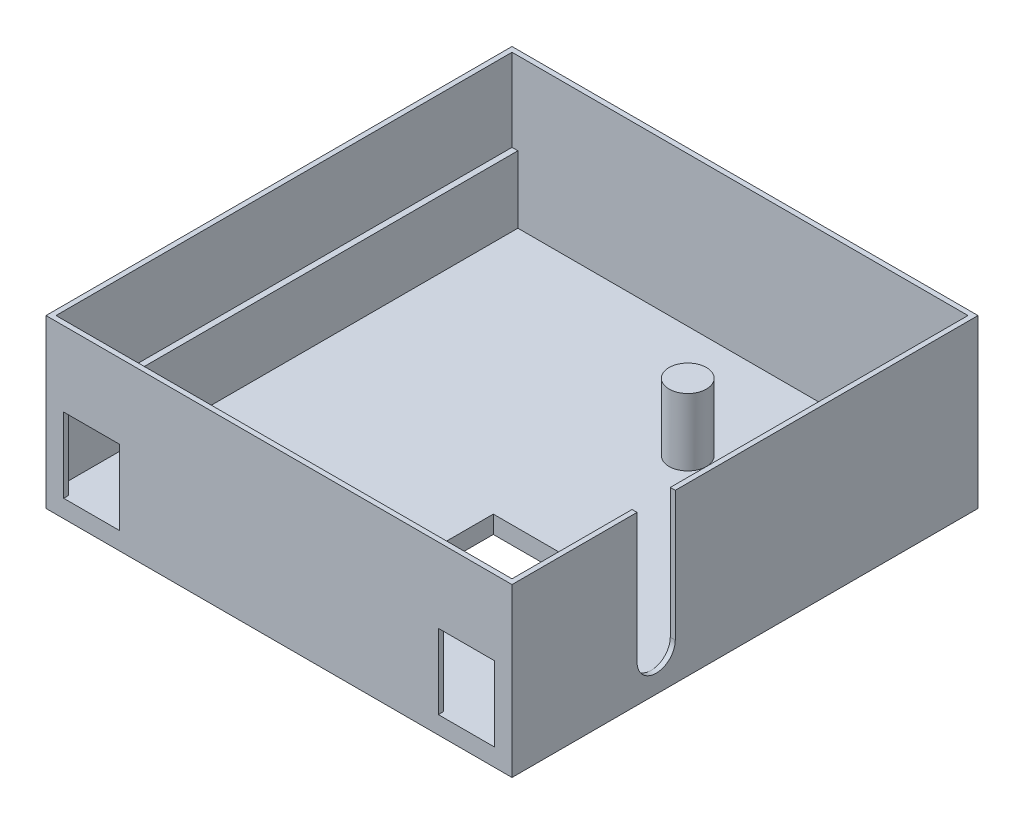
ISO-10303-21;
HEADER;
FILE_DESCRIPTION(('STEP AP214'),'2;1');
FILE_NAME('part.step','',(''),(''),'','','');
FILE_SCHEMA(('AUTOMOTIVE_DESIGN { 1 0 10303 214 1 1 1 1 }'));
ENDSEC;
DATA;
#1=APPLICATION_CONTEXT('core data for automotive mechanical design processes');
#2=APPLICATION_PROTOCOL_DEFINITION('international standard','automotive_design',2000,#1);
#3=PRODUCT_CONTEXT('',#1,'mechanical');
#4=PRODUCT('Part','Part','',(#3));
#5=PRODUCT_RELATED_PRODUCT_CATEGORY('part','',(#4));
#6=PRODUCT_DEFINITION_FORMATION('','',#4);
#7=PRODUCT_DEFINITION_CONTEXT('part definition',#1,'design');
#8=PRODUCT_DEFINITION('design','',#6,#7);
#9=PRODUCT_DEFINITION_SHAPE('','',#8);
#10=(LENGTH_UNIT() NAMED_UNIT(*) SI_UNIT(.MILLI.,.METRE.));
#11=(NAMED_UNIT(*) PLANE_ANGLE_UNIT() SI_UNIT($,.RADIAN.));
#12=(NAMED_UNIT(*) SI_UNIT($,.STERADIAN.) SOLID_ANGLE_UNIT());
#13=UNCERTAINTY_MEASURE_WITH_UNIT(LENGTH_MEASURE(1.E-05),#10,'distance_accuracy_value','');
#14=(GEOMETRIC_REPRESENTATION_CONTEXT(3) GLOBAL_UNCERTAINTY_ASSIGNED_CONTEXT((#13)) GLOBAL_UNIT_ASSIGNED_CONTEXT((#10,
#11,#12)) REPRESENTATION_CONTEXT('',''));
#15=CARTESIAN_POINT('',(0.,0.,0.));
#16=DIRECTION('',(0.,0.,1.));
#17=DIRECTION('',(1.,0.,0.));
#18=AXIS2_PLACEMENT_3D('',#15,#16,#17);
#19=CARTESIAN_POINT('',(-38.75,28.4,-38.75));
#20=DIRECTION('',(0.,0.,1.));
#21=DIRECTION('',(1.,0.,0.));
#22=AXIS2_PLACEMENT_3D('',#19,#20,#21);
#23=PLANE('',#22);
#24=DIRECTION('',(-1.,0.,0.));
#25=VECTOR('',#24,1.);
#26=CARTESIAN_POINT('',(-38.75,14.4,-38.75));
#27=LINE('',#26,#25);
#28=CARTESIAN_POINT('',(-37.75,14.4,-38.75));
#29=VERTEX_POINT('',#28);
#30=CARTESIAN_POINT('',(-38.75,14.4,-38.75));
#31=VERTEX_POINT('',#30);
#32=EDGE_CURVE('E266',#29,#31,#27,.T.);
#33=ORIENTED_EDGE('',*,*,#32,.F.);
#34=DIRECTION('',(0.,-1.,0.));
#35=VECTOR('',#34,1.);
#36=CARTESIAN_POINT('',(-37.75,14.4,-38.75));
#37=LINE('',#36,#35);
#38=CARTESIAN_POINT('',(-37.75,3.,-38.75));
#39=VERTEX_POINT('',#38);
#40=EDGE_CURVE('E270',#29,#39,#37,.T.);
#41=ORIENTED_EDGE('',*,*,#40,.T.);
#42=DIRECTION('',(-1.,0.,0.));
#43=VECTOR('',#42,1.);
#44=CARTESIAN_POINT('',(-38.75,3.,-38.75));
#45=LINE('',#44,#43);
#46=CARTESIAN_POINT('',(38.75,3.,-38.75));
#47=VERTEX_POINT('',#46);
#48=EDGE_CURVE('E418',#47,#39,#45,.T.);
#49=ORIENTED_EDGE('',*,*,#48,.F.);
#50=DIRECTION('',(0.,-1.,0.));
#51=VECTOR('',#50,1.);
#52=CARTESIAN_POINT('',(38.75,28.4,-38.75));
#53=LINE('',#52,#51);
#54=CARTESIAN_POINT('',(38.75,28.4,-38.75));
#55=VERTEX_POINT('',#54);
#56=EDGE_CURVE('E441',#55,#47,#53,.T.);
#57=ORIENTED_EDGE('',*,*,#56,.F.);
#58=DIRECTION('',(-1.,0.,0.));
#59=VECTOR('',#58,1.);
#60=CARTESIAN_POINT('',(-38.75,28.4,-38.75));
#61=LINE('',#60,#59);
#62=CARTESIAN_POINT('',(-38.75,28.4,-38.75));
#63=VERTEX_POINT('',#62);
#64=EDGE_CURVE('E403',#55,#63,#61,.T.);
#65=ORIENTED_EDGE('',*,*,#64,.T.);
#66=DIRECTION('',(0.,-1.,0.));
#67=VECTOR('',#66,1.);
#68=CARTESIAN_POINT('',(-38.75,28.4,-38.75));
#69=LINE('',#68,#67);
#70=EDGE_CURVE('E437',#63,#31,#69,.T.);
#71=ORIENTED_EDGE('',*,*,#70,.T.);
#72=EDGE_LOOP('',(#33,#41,#49,#57,#65,#71));
#73=FACE_BOUND('',#72,.T.);
#74=ADVANCED_FACE('F39',(#73),#23,.T.);
#75=CARTESIAN_POINT('',(-38.75,28.4,38.75));
#76=DIRECTION('',(1.,0.,0.));
#77=DIRECTION('',(0.,0.,-1.));
#78=AXIS2_PLACEMENT_3D('',#75,#76,#77);
#79=PLANE('',#78);
#80=DIRECTION('',(0.,0.,1.));
#81=VECTOR('',#80,1.);
#82=CARTESIAN_POINT('',(-38.75,3.,38.75));
#83=LINE('',#82,#81);
#84=CARTESIAN_POINT('',(-38.75,3.,26.25));
#85=VERTEX_POINT('',#84);
#86=CARTESIAN_POINT('',(-38.75,3.,38.75));
#87=VERTEX_POINT('',#86);
#88=EDGE_CURVE('E421',#85,#87,#83,.T.);
#89=ORIENTED_EDGE('',*,*,#88,.F.);
#90=DIRECTION('',(0.,-1.,0.));
#91=VECTOR('',#90,1.);
#92=CARTESIAN_POINT('',(-38.75,14.4,26.25));
#93=LINE('',#92,#91);
#94=CARTESIAN_POINT('',(-38.75,14.4,26.25));
#95=VERTEX_POINT('',#94);
#96=EDGE_CURVE('E284',#95,#85,#93,.T.);
#97=ORIENTED_EDGE('',*,*,#96,.F.);
#98=DIRECTION('',(0.,0.,1.));
#99=VECTOR('',#98,1.);
#100=CARTESIAN_POINT('',(-38.75,14.4,-38.75));
#101=LINE('',#100,#99);
#102=EDGE_CURVE('E254',#31,#95,#101,.T.);
#103=ORIENTED_EDGE('',*,*,#102,.F.);
#104=ORIENTED_EDGE('',*,*,#70,.F.);
#105=DIRECTION('',(0.,0.,1.));
#106=VECTOR('',#105,1.);
#107=CARTESIAN_POINT('',(-38.75,28.4,38.75));
#108=LINE('',#107,#106);
#109=CARTESIAN_POINT('',(-38.75,28.4,38.75));
#110=VERTEX_POINT('',#109);
#111=EDGE_CURVE('E407',#63,#110,#108,.T.);
#112=ORIENTED_EDGE('',*,*,#111,.T.);
#113=DIRECTION('',(0.,-1.,0.));
#114=VECTOR('',#113,1.);
#115=CARTESIAN_POINT('',(-38.75,28.4,38.75));
#116=LINE('',#115,#114);
#117=EDGE_CURVE('E433',#110,#87,#116,.T.);
#118=ORIENTED_EDGE('',*,*,#117,.T.);
#119=EDGE_LOOP('',(#89,#97,#103,#104,#112,#118));
#120=FACE_BOUND('',#119,.T.);
#121=ADVANCED_FACE('F529',(#120),#79,.T.);
#122=CARTESIAN_POINT('',(0.,3.,0.));
#123=DIRECTION('',(0.,-1.,0.));
#124=DIRECTION('',(0.,0.,-1.));
#125=AXIS2_PLACEMENT_3D('',#122,#123,#124);
#126=PLANE('',#125);
#127=DIRECTION('',(-1.,0.,0.));
#128=VECTOR('',#127,1.);
#129=CARTESIAN_POINT('',(2.2375,3.,5.4125));
#130=LINE('',#129,#128);
#131=CARTESIAN_POINT('',(14.9375,3.,5.4125));
#132=VERTEX_POINT('',#131);
#133=CARTESIAN_POINT('',(2.2375,3.,5.4125));
#134=VERTEX_POINT('',#133);
#135=EDGE_CURVE('E231',#132,#134,#130,.T.);
#136=ORIENTED_EDGE('',*,*,#135,.F.);
#137=DIRECTION('',(0.,0.,-1.));
#138=VECTOR('',#137,1.);
#139=CARTESIAN_POINT('',(14.9375,3.,18.1125));
#140=LINE('',#139,#138);
#141=CARTESIAN_POINT('',(14.9375,3.,18.1125));
#142=VERTEX_POINT('',#141);
#143=EDGE_CURVE('E55',#142,#132,#140,.T.);
#144=ORIENTED_EDGE('',*,*,#143,.F.);
#145=DIRECTION('',(1.,0.,0.));
#146=VECTOR('',#145,1.);
#147=CARTESIAN_POINT('',(2.2375,3.,18.1125));
#148=LINE('',#147,#146);
#149=CARTESIAN_POINT('',(2.2375,3.,18.1125));
#150=VERTEX_POINT('',#149);
#151=EDGE_CURVE('E239',#150,#142,#148,.T.);
#152=ORIENTED_EDGE('',*,*,#151,.F.);
#153=DIRECTION('',(0.,0.,1.));
#154=VECTOR('',#153,1.);
#155=CARTESIAN_POINT('',(2.2375,3.,18.1125));
#156=LINE('',#155,#154);
#157=EDGE_CURVE('E221',#134,#150,#156,.T.);
#158=ORIENTED_EDGE('',*,*,#157,.F.);
#159=EDGE_LOOP('',(#136,#144,#152,#158));
#160=FACE_BOUND('',#159,.T.);
#161=CARTESIAN_POINT('',(10.175,3.,-19.7));
#162=DIRECTION('',(0.,-1.,0.));
#163=DIRECTION('',(0.,0.,-1.));
#164=AXIS2_PLACEMENT_3D('',#161,#162,#163);
#165=CIRCLE('',#164,3.175);
#166=CARTESIAN_POINT('',(10.175,3.,-22.875));
#167=VERTEX_POINT('',#166);
#168=EDGE_CURVE('E497',#167,#167,#165,.F.);
#169=ORIENTED_EDGE('',*,*,#168,.F.);
#170=EDGE_LOOP('',(#169));
#171=FACE_BOUND('',#170,.T.);
#172=DIRECTION('',(1.,0.,0.));
#173=VECTOR('',#172,1.);
#174=CARTESIAN_POINT('',(-38.75,3.,26.25));
#175=LINE('',#174,#173);
#176=CARTESIAN_POINT('',(-37.75,3.,26.25));
#177=VERTEX_POINT('',#176);
#178=EDGE_CURVE('E249',#85,#177,#175,.T.);
#179=ORIENTED_EDGE('',*,*,#178,.F.);
#180=ORIENTED_EDGE('',*,*,#88,.T.);
#181=DIRECTION('',(1.,0.,0.));
#182=VECTOR('',#181,1.);
#183=CARTESIAN_POINT('',(-38.75,3.,38.75));
#184=LINE('',#183,#182);
#185=CARTESIAN_POINT('',(-36.6,3.,38.75));
#186=VERTEX_POINT('',#185);
#187=EDGE_CURVE('E425',#87,#186,#184,.T.);
#188=ORIENTED_EDGE('',*,*,#187,.T.);
#189=DIRECTION('',(0.,0.,1.));
#190=VECTOR('',#189,1.);
#191=CARTESIAN_POINT('',(-36.6,3.,20.55));
#192=LINE('',#191,#190);
#193=CARTESIAN_POINT('',(-36.6,3.,39.6));
#194=VERTEX_POINT('',#193);
#195=EDGE_CURVE('E340',#186,#194,#192,.T.);
#196=ORIENTED_EDGE('',*,*,#195,.T.);
#197=DIRECTION('',(1.,0.,0.));
#198=VECTOR('',#197,1.);
#199=CARTESIAN_POINT('',(-36.6,3.,39.6));
#200=LINE('',#199,#198);
#201=CARTESIAN_POINT('',(-27.075,3.,39.6));
#202=VERTEX_POINT('',#201);
#203=EDGE_CURVE('E333',#194,#202,#200,.T.);
#204=ORIENTED_EDGE('',*,*,#203,.T.);
#205=DIRECTION('',(0.,0.,1.));
#206=VECTOR('',#205,1.);
#207=CARTESIAN_POINT('',(-27.075,3.,20.55));
#208=LINE('',#207,#206);
#209=CARTESIAN_POINT('',(-27.075,3.,38.75));
#210=VERTEX_POINT('',#209);
#211=EDGE_CURVE('E297',#210,#202,#208,.T.);
#212=ORIENTED_EDGE('',*,*,#211,.F.);
#213=CARTESIAN_POINT('',(27.075,3.,38.75));
#214=VERTEX_POINT('',#213);
#215=EDGE_CURVE('E429',#210,#214,#184,.T.);
#216=ORIENTED_EDGE('',*,*,#215,.T.);
#217=DIRECTION('',(0.,0.,1.));
#218=VECTOR('',#217,1.);
#219=CARTESIAN_POINT('',(27.075,3.,20.55));
#220=LINE('',#219,#218);
#221=CARTESIAN_POINT('',(27.075,3.,39.6));
#222=VERTEX_POINT('',#221);
#223=EDGE_CURVE('E314',#214,#222,#220,.T.);
#224=ORIENTED_EDGE('',*,*,#223,.T.);
#225=DIRECTION('',(1.,0.,0.));
#226=VECTOR('',#225,1.);
#227=CARTESIAN_POINT('',(27.075,3.,39.6));
#228=LINE('',#227,#226);
#229=CARTESIAN_POINT('',(36.6,3.,39.6));
#230=VERTEX_POINT('',#229);
#231=EDGE_CURVE('E305',#222,#230,#228,.T.);
#232=ORIENTED_EDGE('',*,*,#231,.T.);
#233=DIRECTION('',(0.,0.,1.));
#234=VECTOR('',#233,1.);
#235=CARTESIAN_POINT('',(36.6,3.,20.55));
#236=LINE('',#235,#234);
#237=CARTESIAN_POINT('',(36.6,3.,38.75));
#238=VERTEX_POINT('',#237);
#239=EDGE_CURVE('E310',#238,#230,#236,.T.);
#240=ORIENTED_EDGE('',*,*,#239,.F.);
#241=CARTESIAN_POINT('',(38.75,3.,38.75));
#242=VERTEX_POINT('',#241);
#243=EDGE_CURVE('E424',#238,#242,#184,.T.);
#244=ORIENTED_EDGE('',*,*,#243,.T.);
#245=DIRECTION('',(0.,0.,-1.));
#246=VECTOR('',#245,1.);
#247=CARTESIAN_POINT('',(38.75,3.,38.75));
#248=LINE('',#247,#246);
#249=EDGE_CURVE('E398',#242,#47,#248,.T.);
#250=ORIENTED_EDGE('',*,*,#249,.T.);
#251=ORIENTED_EDGE('',*,*,#48,.T.);
#252=DIRECTION('',(0.,0.,-1.));
#253=VECTOR('',#252,1.);
#254=CARTESIAN_POINT('',(-37.75,3.,-38.75));
#255=LINE('',#254,#253);
#256=EDGE_CURVE('E259',#177,#39,#255,.T.);
#257=ORIENTED_EDGE('',*,*,#256,.F.);
#258=EDGE_LOOP('',(#179,#180,#188,#196,#204,#212,#216,#224,#232,#240,#244,#250,#251,#257));
#259=FACE_BOUND('',#258,.T.);
#260=ADVANCED_FACE('F236',(#160,#171,#259),#126,.F.);
#261=CARTESIAN_POINT('',(39.6,3.,39.6));
#262=DIRECTION('',(-1.,0.,0.));
#263=DIRECTION('',(0.,0.,1.));
#264=AXIS2_PLACEMENT_3D('',#261,#262,#263);
#265=PLANE('',#264);
#266=DIRECTION('',(0.,0.,-1.));
#267=VECTOR('',#266,1.);
#268=CARTESIAN_POINT('',(39.6,28.4,39.6));
#269=LINE('',#268,#267);
#270=CARTESIAN_POINT('',(39.6,28.4,11.85));
#271=VERTEX_POINT('',#270);
#272=CARTESIAN_POINT('',(39.6,28.4,-39.6));
#273=VERTEX_POINT('',#272);
#274=EDGE_CURVE('E445',#271,#273,#269,.T.);
#275=ORIENTED_EDGE('',*,*,#274,.F.);
#276=DIRECTION('',(0.,1.,0.));
#277=VECTOR('',#276,1.);
#278=CARTESIAN_POINT('',(39.6,0.,11.85));
#279=LINE('',#278,#277);
#280=CARTESIAN_POINT('',(39.6,6.35,11.85));
#281=VERTEX_POINT('',#280);
#282=EDGE_CURVE('E368',#281,#271,#279,.T.);
#283=ORIENTED_EDGE('',*,*,#282,.F.);
#284=CARTESIAN_POINT('',(39.6,6.35,15.1));
#285=DIRECTION('',(1.,0.,0.));
#286=DIRECTION('',(0.,0.,-1.));
#287=AXIS2_PLACEMENT_3D('',#284,#285,#286);
#288=CIRCLE('',#287,3.25);
#289=CARTESIAN_POINT('',(39.6,6.35,18.35));
#290=VERTEX_POINT('',#289);
#291=EDGE_CURVE('E362',#290,#281,#288,.T.);
#292=ORIENTED_EDGE('',*,*,#291,.F.);
#293=DIRECTION('',(0.,-1.,0.));
#294=VECTOR('',#293,1.);
#295=CARTESIAN_POINT('',(39.6,0.,18.35));
#296=LINE('',#295,#294);
#297=CARTESIAN_POINT('',(39.6,28.4,18.35));
#298=VERTEX_POINT('',#297);
#299=EDGE_CURVE('E363',#298,#290,#296,.T.);
#300=ORIENTED_EDGE('',*,*,#299,.F.);
#301=CARTESIAN_POINT('',(39.6,28.4,39.6));
#302=VERTEX_POINT('',#301);
#303=EDGE_CURVE('E446',#302,#298,#269,.T.);
#304=ORIENTED_EDGE('',*,*,#303,.F.);
#305=DIRECTION('',(0.,-1.,0.));
#306=VECTOR('',#305,1.);
#307=CARTESIAN_POINT('',(39.6,3.,39.6));
#308=LINE('',#307,#306);
#309=CARTESIAN_POINT('',(39.6,0.,39.6));
#310=VERTEX_POINT('',#309);
#311=EDGE_CURVE('E475',#302,#310,#308,.T.);
#312=ORIENTED_EDGE('',*,*,#311,.T.);
#313=DIRECTION('',(0.,0.,-1.));
#314=VECTOR('',#313,1.);
#315=CARTESIAN_POINT('',(39.6,0.,39.6));
#316=LINE('',#315,#314);
#317=CARTESIAN_POINT('',(39.6,0.,-39.6));
#318=VERTEX_POINT('',#317);
#319=EDGE_CURVE('E462',#310,#318,#316,.T.);
#320=ORIENTED_EDGE('',*,*,#319,.T.);
#321=DIRECTION('',(0.,-1.,0.));
#322=VECTOR('',#321,1.);
#323=CARTESIAN_POINT('',(39.6,3.,-39.6));
#324=LINE('',#323,#322);
#325=EDGE_CURVE('E487',#273,#318,#324,.T.);
#326=ORIENTED_EDGE('',*,*,#325,.F.);
#327=EDGE_LOOP('',(#275,#283,#292,#300,#304,#312,#320,#326));
#328=FACE_BOUND('',#327,.T.);
#329=ADVANCED_FACE('F41',(#328),#265,.F.);
#330=CARTESIAN_POINT('',(-39.6,3.,-39.6));
#331=DIRECTION('',(0.,0.,1.));
#332=DIRECTION('',(1.,0.,0.));
#333=AXIS2_PLACEMENT_3D('',#330,#331,#332);
#334=PLANE('',#333);
#335=DIRECTION('',(-1.,0.,0.));
#336=VECTOR('',#335,1.);
#337=CARTESIAN_POINT('',(-39.6,0.,-39.6));
#338=LINE('',#337,#336);
#339=CARTESIAN_POINT('',(-39.6,0.,-39.6));
#340=VERTEX_POINT('',#339);
#341=EDGE_CURVE('E466',#318,#340,#338,.T.);
#342=ORIENTED_EDGE('',*,*,#341,.T.);
#343=DIRECTION('',(0.,-1.,0.));
#344=VECTOR('',#343,1.);
#345=CARTESIAN_POINT('',(-39.6,3.,-39.6));
#346=LINE('',#345,#344);
#347=CARTESIAN_POINT('',(-39.6,28.4,-39.6));
#348=VERTEX_POINT('',#347);
#349=EDGE_CURVE('E483',#348,#340,#346,.T.);
#350=ORIENTED_EDGE('',*,*,#349,.F.);
#351=DIRECTION('',(-1.,0.,0.));
#352=VECTOR('',#351,1.);
#353=CARTESIAN_POINT('',(-39.6,28.4,-39.6));
#354=LINE('',#353,#352);
#355=EDGE_CURVE('E450',#273,#348,#354,.T.);
#356=ORIENTED_EDGE('',*,*,#355,.F.);
#357=ORIENTED_EDGE('',*,*,#325,.T.);
#358=EDGE_LOOP('',(#342,#350,#356,#357));
#359=FACE_BOUND('',#358,.T.);
#360=ADVANCED_FACE('F558',(#359),#334,.F.);
#361=CARTESIAN_POINT('',(-39.6,3.,39.6));
#362=DIRECTION('',(1.,0.,0.));
#363=DIRECTION('',(0.,0.,-1.));
#364=AXIS2_PLACEMENT_3D('',#361,#362,#363);
#365=PLANE('',#364);
#366=DIRECTION('',(0.,0.,1.));
#367=VECTOR('',#366,1.);
#368=CARTESIAN_POINT('',(-39.6,0.,39.6));
#369=LINE('',#368,#367);
#370=CARTESIAN_POINT('',(-39.6,0.,39.6));
#371=VERTEX_POINT('',#370);
#372=EDGE_CURVE('E469',#340,#371,#369,.T.);
#373=ORIENTED_EDGE('',*,*,#372,.T.);
#374=DIRECTION('',(0.,-1.,0.));
#375=VECTOR('',#374,1.);
#376=CARTESIAN_POINT('',(-39.6,3.,39.6));
#377=LINE('',#376,#375);
#378=CARTESIAN_POINT('',(-39.6,28.4,39.6));
#379=VERTEX_POINT('',#378);
#380=EDGE_CURVE('E479',#379,#371,#377,.T.);
#381=ORIENTED_EDGE('',*,*,#380,.F.);
#382=DIRECTION('',(0.,0.,1.));
#383=VECTOR('',#382,1.);
#384=CARTESIAN_POINT('',(-39.6,28.4,39.6));
#385=LINE('',#384,#383);
#386=EDGE_CURVE('E454',#348,#379,#385,.T.);
#387=ORIENTED_EDGE('',*,*,#386,.F.);
#388=ORIENTED_EDGE('',*,*,#349,.T.);
#389=EDGE_LOOP('',(#373,#381,#387,#388));
#390=FACE_BOUND('',#389,.T.);
#391=ADVANCED_FACE('F555',(#390),#365,.F.);
#392=CARTESIAN_POINT('',(-39.6,3.,39.6));
#393=DIRECTION('',(0.,0.,-1.));
#394=DIRECTION('',(-1.,0.,0.));
#395=AXIS2_PLACEMENT_3D('',#392,#393,#394);
#396=PLANE('',#395);
#397=DIRECTION('',(-1.,0.,0.));
#398=VECTOR('',#397,1.);
#399=CARTESIAN_POINT('',(27.075,15.7,39.6));
#400=LINE('',#399,#398);
#401=CARTESIAN_POINT('',(36.6,15.7,39.6));
#402=VERTEX_POINT('',#401);
#403=CARTESIAN_POINT('',(27.075,15.7,39.6));
#404=VERTEX_POINT('',#403);
#405=EDGE_CURVE('E296',#402,#404,#400,.T.);
#406=ORIENTED_EDGE('',*,*,#405,.F.);
#407=DIRECTION('',(0.,1.,0.));
#408=VECTOR('',#407,1.);
#409=CARTESIAN_POINT('',(36.6,3.,39.6));
#410=LINE('',#409,#408);
#411=EDGE_CURVE('E293',#230,#402,#410,.T.);
#412=ORIENTED_EDGE('',*,*,#411,.F.);
#413=ORIENTED_EDGE('',*,*,#231,.F.);
#414=DIRECTION('',(0.,-1.,0.));
#415=VECTOR('',#414,1.);
#416=CARTESIAN_POINT('',(27.075,3.,39.6));
#417=LINE('',#416,#415);
#418=EDGE_CURVE('E301',#404,#222,#417,.T.);
#419=ORIENTED_EDGE('',*,*,#418,.F.);
#420=EDGE_LOOP('',(#406,#412,#413,#419));
#421=FACE_BOUND('',#420,.T.);
#422=DIRECTION('',(-1.,0.,0.));
#423=VECTOR('',#422,1.);
#424=CARTESIAN_POINT('',(-36.6,15.7,39.6));
#425=LINE('',#424,#423);
#426=CARTESIAN_POINT('',(-27.075,15.7,39.6));
#427=VERTEX_POINT('',#426);
#428=CARTESIAN_POINT('',(-36.6,15.7,39.6));
#429=VERTEX_POINT('',#428);
#430=EDGE_CURVE('E325',#427,#429,#425,.T.);
#431=ORIENTED_EDGE('',*,*,#430,.F.);
#432=DIRECTION('',(0.,1.,0.));
#433=VECTOR('',#432,1.);
#434=CARTESIAN_POINT('',(-27.075,15.7,39.6));
#435=LINE('',#434,#433);
#436=EDGE_CURVE('E292',#202,#427,#435,.T.);
#437=ORIENTED_EDGE('',*,*,#436,.F.);
#438=ORIENTED_EDGE('',*,*,#203,.F.);
#439=DIRECTION('',(0.,-1.,0.));
#440=VECTOR('',#439,1.);
#441=CARTESIAN_POINT('',(-36.6,15.7,39.6));
#442=LINE('',#441,#440);
#443=EDGE_CURVE('E329',#429,#194,#442,.T.);
#444=ORIENTED_EDGE('',*,*,#443,.F.);
#445=EDGE_LOOP('',(#431,#437,#438,#444));
#446=FACE_BOUND('',#445,.T.);
#447=DIRECTION('',(1.,0.,0.));
#448=VECTOR('',#447,1.);
#449=CARTESIAN_POINT('',(-39.6,0.,39.6));
#450=LINE('',#449,#448);
#451=EDGE_CURVE('E472',#371,#310,#450,.T.);
#452=ORIENTED_EDGE('',*,*,#451,.T.);
#453=ORIENTED_EDGE('',*,*,#311,.F.);
#454=DIRECTION('',(1.,0.,0.));
#455=VECTOR('',#454,1.);
#456=CARTESIAN_POINT('',(-39.6,28.4,39.6));
#457=LINE('',#456,#455);
#458=EDGE_CURVE('E458',#379,#302,#457,.T.);
#459=ORIENTED_EDGE('',*,*,#458,.F.);
#460=ORIENTED_EDGE('',*,*,#380,.T.);
#461=EDGE_LOOP('',(#452,#453,#459,#460));
#462=FACE_BOUND('',#461,.T.);
#463=ADVANCED_FACE('F552',(#421,#446,#462),#396,.F.);
#464=CARTESIAN_POINT('',(0.,0.,0.));
#465=DIRECTION('',(0.,-1.,0.));
#466=DIRECTION('',(0.,0.,-1.));
#467=AXIS2_PLACEMENT_3D('',#464,#465,#466);
#468=PLANE('',#467);
#469=DIRECTION('',(0.,0.,1.));
#470=VECTOR('',#469,1.);
#471=CARTESIAN_POINT('',(14.9375,0.,0.));
#472=LINE('',#471,#470);
#473=CARTESIAN_POINT('',(14.9375,0.,5.4125));
#474=VERTEX_POINT('',#473);
#475=CARTESIAN_POINT('',(14.9375,0.,18.1125));
#476=VERTEX_POINT('',#475);
#477=EDGE_CURVE('E11',#474,#476,#472,.T.);
#478=ORIENTED_EDGE('',*,*,#477,.F.);
#479=DIRECTION('',(1.,0.,0.));
#480=VECTOR('',#479,1.);
#481=CARTESIAN_POINT('',(0.,0.,5.4125));
#482=LINE('',#481,#480);
#483=CARTESIAN_POINT('',(2.2375,0.,5.4125));
#484=VERTEX_POINT('',#483);
#485=EDGE_CURVE('E501',#484,#474,#482,.T.);
#486=ORIENTED_EDGE('',*,*,#485,.F.);
#487=DIRECTION('',(0.,0.,-1.));
#488=VECTOR('',#487,1.);
#489=CARTESIAN_POINT('',(2.2375,0.,0.));
#490=LINE('',#489,#488);
#491=CARTESIAN_POINT('',(2.2375,0.,18.1125));
#492=VERTEX_POINT('',#491);
#493=EDGE_CURVE('E224',#492,#484,#490,.T.);
#494=ORIENTED_EDGE('',*,*,#493,.F.);
#495=DIRECTION('',(-1.,0.,0.));
#496=VECTOR('',#495,1.);
#497=CARTESIAN_POINT('',(0.,0.,18.1125));
#498=LINE('',#497,#496);
#499=EDGE_CURVE('E48',#476,#492,#498,.T.);
#500=ORIENTED_EDGE('',*,*,#499,.F.);
#501=EDGE_LOOP('',(#478,#486,#494,#500));
#502=FACE_BOUND('',#501,.T.);
#503=ORIENTED_EDGE('',*,*,#319,.F.);
#504=ORIENTED_EDGE('',*,*,#451,.F.);
#505=ORIENTED_EDGE('',*,*,#372,.F.);
#506=ORIENTED_EDGE('',*,*,#341,.F.);
#507=EDGE_LOOP('',(#503,#504,#505,#506));
#508=FACE_BOUND('',#507,.T.);
#509=ADVANCED_FACE('F512',(#502,#508),#468,.T.);
#510=CARTESIAN_POINT('',(0.,28.4,0.));
#511=DIRECTION('',(0.,-1.,0.));
#512=DIRECTION('',(0.,0.,-1.));
#513=AXIS2_PLACEMENT_3D('',#510,#511,#512);
#514=PLANE('',#513);
#515=DIRECTION('',(0.,0.,-1.));
#516=VECTOR('',#515,1.);
#517=CARTESIAN_POINT('',(38.75,28.4,38.75));
#518=LINE('',#517,#516);
#519=CARTESIAN_POINT('',(38.75,28.4,11.85));
#520=VERTEX_POINT('',#519);
#521=EDGE_CURVE('E404',#520,#55,#518,.T.);
#522=ORIENTED_EDGE('',*,*,#521,.F.);
#523=DIRECTION('',(1.,0.,0.));
#524=VECTOR('',#523,1.);
#525=CARTESIAN_POINT('',(12.6283614602759,28.4,11.85));
#526=LINE('',#525,#524);
#527=EDGE_CURVE('E377',#520,#271,#526,.T.);
#528=ORIENTED_EDGE('',*,*,#527,.T.);
#529=ORIENTED_EDGE('',*,*,#274,.T.);
#530=ORIENTED_EDGE('',*,*,#355,.T.);
#531=ORIENTED_EDGE('',*,*,#386,.T.);
#532=ORIENTED_EDGE('',*,*,#458,.T.);
#533=ORIENTED_EDGE('',*,*,#303,.T.);
#534=DIRECTION('',(1.,0.,0.));
#535=VECTOR('',#534,1.);
#536=CARTESIAN_POINT('',(12.6283614602759,28.4,18.35));
#537=LINE('',#536,#535);
#538=CARTESIAN_POINT('',(38.75,28.4,18.35));
#539=VERTEX_POINT('',#538);
#540=EDGE_CURVE('E388',#539,#298,#537,.T.);
#541=ORIENTED_EDGE('',*,*,#540,.F.);
#542=CARTESIAN_POINT('',(38.75,28.4,38.75));
#543=VERTEX_POINT('',#542);
#544=EDGE_CURVE('E399',#543,#539,#518,.T.);
#545=ORIENTED_EDGE('',*,*,#544,.F.);
#546=DIRECTION('',(1.,0.,0.));
#547=VECTOR('',#546,1.);
#548=CARTESIAN_POINT('',(-38.75,28.4,38.75));
#549=LINE('',#548,#547);
#550=EDGE_CURVE('E411',#110,#543,#549,.T.);
#551=ORIENTED_EDGE('',*,*,#550,.F.);
#552=ORIENTED_EDGE('',*,*,#111,.F.);
#553=ORIENTED_EDGE('',*,*,#64,.F.);
#554=EDGE_LOOP('',(#522,#528,#529,#530,#531,#532,#533,#541,#545,#551,#552,#553));
#555=FACE_BOUND('',#554,.T.);
#556=ADVANCED_FACE('F543',(#555),#514,.F.);
#557=CARTESIAN_POINT('',(38.75,28.4,38.75));
#558=DIRECTION('',(-1.,0.,0.));
#559=DIRECTION('',(0.,0.,1.));
#560=AXIS2_PLACEMENT_3D('',#557,#558,#559);
#561=PLANE('',#560);
#562=DIRECTION('',(0.,1.,0.));
#563=VECTOR('',#562,1.);
#564=CARTESIAN_POINT('',(38.75,0.,11.85));
#565=LINE('',#564,#563);
#566=CARTESIAN_POINT('',(38.75,6.35,11.85));
#567=VERTEX_POINT('',#566);
#568=EDGE_CURVE('E367',#567,#520,#565,.T.);
#569=ORIENTED_EDGE('',*,*,#568,.T.);
#570=ORIENTED_EDGE('',*,*,#521,.T.);
#571=ORIENTED_EDGE('',*,*,#56,.T.);
#572=ORIENTED_EDGE('',*,*,#249,.F.);
#573=DIRECTION('',(0.,-1.,0.));
#574=VECTOR('',#573,1.);
#575=CARTESIAN_POINT('',(38.75,28.4,38.75));
#576=LINE('',#575,#574);
#577=EDGE_CURVE('E414',#543,#242,#576,.T.);
#578=ORIENTED_EDGE('',*,*,#577,.F.);
#579=ORIENTED_EDGE('',*,*,#544,.T.);
#580=DIRECTION('',(0.,-1.,0.));
#581=VECTOR('',#580,1.);
#582=CARTESIAN_POINT('',(38.75,0.,18.35));
#583=LINE('',#582,#581);
#584=CARTESIAN_POINT('',(38.75,6.35,18.35));
#585=VERTEX_POINT('',#584);
#586=EDGE_CURVE('E384',#539,#585,#583,.T.);
#587=ORIENTED_EDGE('',*,*,#586,.T.);
#588=CARTESIAN_POINT('',(38.75,6.35,15.1));
#589=DIRECTION('',(-1.,0.,0.));
#590=DIRECTION('',(0.,0.,1.));
#591=AXIS2_PLACEMENT_3D('',#588,#589,#590);
#592=CIRCLE('',#591,3.25);
#593=EDGE_CURVE('E378',#585,#567,#592,.F.);
#594=ORIENTED_EDGE('',*,*,#593,.T.);
#595=EDGE_LOOP('',(#569,#570,#571,#572,#578,#579,#587,#594));
#596=FACE_BOUND('',#595,.T.);
#597=ADVANCED_FACE('F539',(#596),#561,.T.);
#598=CARTESIAN_POINT('',(-38.75,28.4,38.75));
#599=DIRECTION('',(0.,0.,-1.));
#600=DIRECTION('',(-1.,0.,0.));
#601=AXIS2_PLACEMENT_3D('',#598,#599,#600);
#602=PLANE('',#601);
#603=DIRECTION('',(0.,-1.,0.));
#604=VECTOR('',#603,1.);
#605=CARTESIAN_POINT('',(36.6,28.4,38.75));
#606=LINE('',#605,#604);
#607=CARTESIAN_POINT('',(36.6,15.7,38.75));
#608=VERTEX_POINT('',#607);
#609=EDGE_CURVE('E359',#608,#238,#606,.T.);
#610=ORIENTED_EDGE('',*,*,#609,.F.);
#611=DIRECTION('',(1.,0.,0.));
#612=VECTOR('',#611,1.);
#613=CARTESIAN_POINT('',(-38.75,15.7,38.75));
#614=LINE('',#613,#612);
#615=CARTESIAN_POINT('',(27.075,15.7,38.75));
#616=VERTEX_POINT('',#615);
#617=EDGE_CURVE('E494',#616,#608,#614,.T.);
#618=ORIENTED_EDGE('',*,*,#617,.F.);
#619=DIRECTION('',(0.,1.,0.));
#620=VECTOR('',#619,1.);
#621=CARTESIAN_POINT('',(27.075,28.4,38.75));
#622=LINE('',#621,#620);
#623=EDGE_CURVE('E355',#214,#616,#622,.T.);
#624=ORIENTED_EDGE('',*,*,#623,.F.);
#625=ORIENTED_EDGE('',*,*,#215,.F.);
#626=DIRECTION('',(0.,-1.,0.));
#627=VECTOR('',#626,1.);
#628=CARTESIAN_POINT('',(-27.075,28.4,38.75));
#629=LINE('',#628,#627);
#630=CARTESIAN_POINT('',(-27.075,15.7,38.75));
#631=VERTEX_POINT('',#630);
#632=EDGE_CURVE('E352',#631,#210,#629,.T.);
#633=ORIENTED_EDGE('',*,*,#632,.F.);
#634=DIRECTION('',(1.,0.,0.));
#635=VECTOR('',#634,1.);
#636=CARTESIAN_POINT('',(-38.75,15.7,38.75));
#637=LINE('',#636,#635);
#638=CARTESIAN_POINT('',(-36.6,15.7,38.75));
#639=VERTEX_POINT('',#638);
#640=EDGE_CURVE('E491',#639,#631,#637,.T.);
#641=ORIENTED_EDGE('',*,*,#640,.F.);
#642=DIRECTION('',(0.,1.,0.));
#643=VECTOR('',#642,1.);
#644=CARTESIAN_POINT('',(-36.6,28.4,38.75));
#645=LINE('',#644,#643);
#646=EDGE_CURVE('E313',#186,#639,#645,.T.);
#647=ORIENTED_EDGE('',*,*,#646,.F.);
#648=ORIENTED_EDGE('',*,*,#187,.F.);
#649=ORIENTED_EDGE('',*,*,#117,.F.);
#650=ORIENTED_EDGE('',*,*,#550,.T.);
#651=ORIENTED_EDGE('',*,*,#577,.T.);
#652=ORIENTED_EDGE('',*,*,#243,.F.);
#653=EDGE_LOOP('',(#610,#618,#624,#625,#633,#641,#647,#648,#649,#650,#651,#652));
#654=FACE_BOUND('',#653,.T.);
#655=ADVANCED_FACE('F542',(#654),#602,.T.);
#656=CARTESIAN_POINT('',(12.6283614602759,0.,11.85));
#657=DIRECTION('',(0.,0.,-1.));
#658=DIRECTION('',(-1.,0.,0.));
#659=AXIS2_PLACEMENT_3D('',#656,#657,#658);
#660=PLANE('',#659);
#661=DIRECTION('',(1.,0.,0.));
#662=VECTOR('',#661,1.);
#663=CARTESIAN_POINT('',(12.6283614602759,6.35,11.85));
#664=LINE('',#663,#662);
#665=EDGE_CURVE('E382',#567,#281,#664,.T.);
#666=ORIENTED_EDGE('',*,*,#665,.T.);
#667=ORIENTED_EDGE('',*,*,#282,.T.);
#668=ORIENTED_EDGE('',*,*,#527,.F.);
#669=ORIENTED_EDGE('',*,*,#568,.F.);
#670=EDGE_LOOP('',(#666,#667,#668,#669));
#671=FACE_BOUND('',#670,.T.);
#672=ADVANCED_FACE('F664',(#671),#660,.F.);
#673=CARTESIAN_POINT('',(12.6283614602759,0.,18.35));
#674=DIRECTION('',(0.,0.,1.));
#675=DIRECTION('',(0.,-1.,0.));
#676=AXIS2_PLACEMENT_3D('',#673,#674,#675);
#677=PLANE('',#676);
#678=ORIENTED_EDGE('',*,*,#540,.T.);
#679=ORIENTED_EDGE('',*,*,#299,.T.);
#680=DIRECTION('',(1.,0.,0.));
#681=VECTOR('',#680,1.);
#682=CARTESIAN_POINT('',(12.6283614602759,6.35,18.35));
#683=LINE('',#682,#681);
#684=EDGE_CURVE('E383',#585,#290,#683,.T.);
#685=ORIENTED_EDGE('',*,*,#684,.F.);
#686=ORIENTED_EDGE('',*,*,#586,.F.);
#687=EDGE_LOOP('',(#678,#679,#685,#686));
#688=FACE_BOUND('',#687,.T.);
#689=ADVANCED_FACE('F660',(#688),#677,.F.);
#690=CARTESIAN_POINT('',(12.6283614602759,6.35,15.1));
#691=DIRECTION('',(1.,0.,0.));
#692=DIRECTION('',(0.,0.,-1.));
#693=AXIS2_PLACEMENT_3D('',#690,#691,#692);
#694=CYLINDRICAL_SURFACE('',#693,3.25);
#695=ORIENTED_EDGE('',*,*,#684,.T.);
#696=ORIENTED_EDGE('',*,*,#291,.T.);
#697=ORIENTED_EDGE('',*,*,#665,.F.);
#698=ORIENTED_EDGE('',*,*,#593,.F.);
#699=EDGE_LOOP('',(#695,#696,#697,#698));
#700=FACE_BOUND('',#699,.T.);
#701=ADVANCED_FACE('F657',(#700),#694,.F.);
#702=CARTESIAN_POINT('',(-27.075,15.7,20.55));
#703=DIRECTION('',(1.,0.,0.));
#704=DIRECTION('',(0.,1.,0.));
#705=AXIS2_PLACEMENT_3D('',#702,#703,#704);
#706=PLANE('',#705);
#707=ORIENTED_EDGE('',*,*,#632,.T.);
#708=ORIENTED_EDGE('',*,*,#211,.T.);
#709=ORIENTED_EDGE('',*,*,#436,.T.);
#710=DIRECTION('',(0.,0.,1.));
#711=VECTOR('',#710,1.);
#712=CARTESIAN_POINT('',(-27.075,15.7,20.55));
#713=LINE('',#712,#711);
#714=EDGE_CURVE('E337',#631,#427,#713,.T.);
#715=ORIENTED_EDGE('',*,*,#714,.F.);
#716=EDGE_LOOP('',(#707,#708,#709,#715));
#717=FACE_BOUND('',#716,.T.);
#718=ADVANCED_FACE('F651',(#717),#706,.F.);
#719=CARTESIAN_POINT('',(-36.6,15.7,20.55));
#720=DIRECTION('',(-1.,0.,0.));
#721=DIRECTION('',(0.,0.,1.));
#722=AXIS2_PLACEMENT_3D('',#719,#720,#721);
#723=PLANE('',#722);
#724=ORIENTED_EDGE('',*,*,#646,.T.);
#725=DIRECTION('',(0.,0.,1.));
#726=VECTOR('',#725,1.);
#727=CARTESIAN_POINT('',(-36.6,15.7,20.55));
#728=LINE('',#727,#726);
#729=EDGE_CURVE('E343',#639,#429,#728,.T.);
#730=ORIENTED_EDGE('',*,*,#729,.T.);
#731=ORIENTED_EDGE('',*,*,#443,.T.);
#732=ORIENTED_EDGE('',*,*,#195,.F.);
#733=EDGE_LOOP('',(#724,#730,#731,#732));
#734=FACE_BOUND('',#733,.T.);
#735=ADVANCED_FACE('F612',(#734),#723,.F.);
#736=CARTESIAN_POINT('',(-36.6,15.7,20.55));
#737=DIRECTION('',(0.,1.,0.));
#738=DIRECTION('',(0.,0.,1.));
#739=AXIS2_PLACEMENT_3D('',#736,#737,#738);
#740=PLANE('',#739);
#741=ORIENTED_EDGE('',*,*,#640,.T.);
#742=ORIENTED_EDGE('',*,*,#714,.T.);
#743=ORIENTED_EDGE('',*,*,#430,.T.);
#744=ORIENTED_EDGE('',*,*,#729,.F.);
#745=EDGE_LOOP('',(#741,#742,#743,#744));
#746=FACE_BOUND('',#745,.T.);
#747=ADVANCED_FACE('F648',(#746),#740,.F.);
#748=CARTESIAN_POINT('',(36.6,3.,20.55));
#749=DIRECTION('',(1.,0.,0.));
#750=DIRECTION('',(0.,0.,-1.));
#751=AXIS2_PLACEMENT_3D('',#748,#749,#750);
#752=PLANE('',#751);
#753=ORIENTED_EDGE('',*,*,#609,.T.);
#754=ORIENTED_EDGE('',*,*,#239,.T.);
#755=ORIENTED_EDGE('',*,*,#411,.T.);
#756=DIRECTION('',(0.,0.,1.));
#757=VECTOR('',#756,1.);
#758=CARTESIAN_POINT('',(36.6,15.7,20.55));
#759=LINE('',#758,#757);
#760=EDGE_CURVE('E309',#608,#402,#759,.T.);
#761=ORIENTED_EDGE('',*,*,#760,.F.);
#762=EDGE_LOOP('',(#753,#754,#755,#761));
#763=FACE_BOUND('',#762,.T.);
#764=ADVANCED_FACE('F631',(#763),#752,.F.);
#765=CARTESIAN_POINT('',(27.075,3.,20.55));
#766=DIRECTION('',(-1.,0.,0.));
#767=DIRECTION('',(0.,0.,1.));
#768=AXIS2_PLACEMENT_3D('',#765,#766,#767);
#769=PLANE('',#768);
#770=ORIENTED_EDGE('',*,*,#623,.T.);
#771=DIRECTION('',(0.,0.,1.));
#772=VECTOR('',#771,1.);
#773=CARTESIAN_POINT('',(27.075,15.7,20.55));
#774=LINE('',#773,#772);
#775=EDGE_CURVE('E317',#616,#404,#774,.T.);
#776=ORIENTED_EDGE('',*,*,#775,.T.);
#777=ORIENTED_EDGE('',*,*,#418,.T.);
#778=ORIENTED_EDGE('',*,*,#223,.F.);
#779=EDGE_LOOP('',(#770,#776,#777,#778));
#780=FACE_BOUND('',#779,.T.);
#781=ADVANCED_FACE('F624',(#780),#769,.F.);
#782=CARTESIAN_POINT('',(27.075,15.7,20.55));
#783=DIRECTION('',(0.,1.,0.));
#784=DIRECTION('',(0.,0.,1.));
#785=AXIS2_PLACEMENT_3D('',#782,#783,#784);
#786=PLANE('',#785);
#787=ORIENTED_EDGE('',*,*,#617,.T.);
#788=ORIENTED_EDGE('',*,*,#760,.T.);
#789=ORIENTED_EDGE('',*,*,#405,.T.);
#790=ORIENTED_EDGE('',*,*,#775,.F.);
#791=EDGE_LOOP('',(#787,#788,#789,#790));
#792=FACE_BOUND('',#791,.T.);
#793=ADVANCED_FACE('F633',(#792),#786,.F.);
#794=CARTESIAN_POINT('',(10.175,14.4,-19.7));
#795=DIRECTION('',(0.,-1.,0.));
#796=DIRECTION('',(0.,0.,-1.));
#797=AXIS2_PLACEMENT_3D('',#794,#795,#796);
#798=CYLINDRICAL_SURFACE('',#797,3.175);
#799=CARTESIAN_POINT('',(10.175,14.4,-19.7));
#800=DIRECTION('',(0.,1.,0.));
#801=DIRECTION('',(0.,0.,1.));
#802=AXIS2_PLACEMENT_3D('',#799,#800,#801);
#803=CIRCLE('',#802,3.175);
#804=CARTESIAN_POINT('',(10.175,14.4,-16.525));
#805=VERTEX_POINT('',#804);
#806=EDGE_CURVE('E288',#805,#805,#803,.T.);
#807=ORIENTED_EDGE('',*,*,#806,.F.);
#808=EDGE_LOOP('',(#807));
#809=FACE_BOUND('',#808,.T.);
#810=ORIENTED_EDGE('',*,*,#168,.T.);
#811=EDGE_LOOP('',(#810));
#812=FACE_BOUND('',#811,.T.);
#813=ADVANCED_FACE('F635',(#809,#812),#798,.T.);
#814=CARTESIAN_POINT('',(10.175,14.4,-19.7));
#815=DIRECTION('',(0.,1.,0.));
#816=DIRECTION('',(0.,0.,1.));
#817=AXIS2_PLACEMENT_3D('',#814,#815,#816);
#818=PLANE('',#817);
#819=ORIENTED_EDGE('',*,*,#806,.T.);
#820=EDGE_LOOP('',(#819));
#821=FACE_BOUND('',#820,.T.);
#822=ADVANCED_FACE('F641',(#821),#818,.T.);
#823=CARTESIAN_POINT('',(-38.75,14.4,26.25));
#824=DIRECTION('',(0.,0.,-1.));
#825=DIRECTION('',(-1.,0.,0.));
#826=AXIS2_PLACEMENT_3D('',#823,#824,#825);
#827=PLANE('',#826);
#828=ORIENTED_EDGE('',*,*,#178,.T.);
#829=DIRECTION('',(0.,-1.,0.));
#830=VECTOR('',#829,1.);
#831=CARTESIAN_POINT('',(-37.75,14.4,26.25));
#832=LINE('',#831,#830);
#833=CARTESIAN_POINT('',(-37.75,14.4,26.25));
#834=VERTEX_POINT('',#833);
#835=EDGE_CURVE('E280',#834,#177,#832,.T.);
#836=ORIENTED_EDGE('',*,*,#835,.F.);
#837=DIRECTION('',(1.,0.,0.));
#838=VECTOR('',#837,1.);
#839=CARTESIAN_POINT('',(-38.75,14.4,26.25));
#840=LINE('',#839,#838);
#841=EDGE_CURVE('E258',#95,#834,#840,.T.);
#842=ORIENTED_EDGE('',*,*,#841,.F.);
#843=ORIENTED_EDGE('',*,*,#96,.T.);
#844=EDGE_LOOP('',(#828,#836,#842,#843));
#845=FACE_BOUND('',#844,.T.);
#846=ADVANCED_FACE('F607',(#845),#827,.F.);
#847=CARTESIAN_POINT('',(-37.75,14.4,-38.75));
#848=DIRECTION('',(-1.,0.,0.));
#849=DIRECTION('',(0.,0.,1.));
#850=AXIS2_PLACEMENT_3D('',#847,#848,#849);
#851=PLANE('',#850);
#852=ORIENTED_EDGE('',*,*,#256,.T.);
#853=ORIENTED_EDGE('',*,*,#40,.F.);
#854=DIRECTION('',(0.,0.,-1.));
#855=VECTOR('',#854,1.);
#856=CARTESIAN_POINT('',(-37.75,14.4,-38.75));
#857=LINE('',#856,#855);
#858=EDGE_CURVE('E262',#834,#29,#857,.T.);
#859=ORIENTED_EDGE('',*,*,#858,.F.);
#860=ORIENTED_EDGE('',*,*,#835,.T.);
#861=EDGE_LOOP('',(#852,#853,#859,#860));
#862=FACE_BOUND('',#861,.T.);
#863=ADVANCED_FACE('F524',(#862),#851,.F.);
#864=CARTESIAN_POINT('',(0.,14.4,0.));
#865=DIRECTION('',(0.,1.,0.));
#866=DIRECTION('',(0.,0.,1.));
#867=AXIS2_PLACEMENT_3D('',#864,#865,#866);
#868=PLANE('',#867);
#869=ORIENTED_EDGE('',*,*,#102,.T.);
#870=ORIENTED_EDGE('',*,*,#841,.T.);
#871=ORIENTED_EDGE('',*,*,#858,.T.);
#872=ORIENTED_EDGE('',*,*,#32,.T.);
#873=EDGE_LOOP('',(#869,#870,#871,#872));
#874=FACE_BOUND('',#873,.T.);
#875=ADVANCED_FACE('F517',(#874),#868,.T.);
#876=CARTESIAN_POINT('',(14.9375,-23.,18.1125));
#877=DIRECTION('',(1.,0.,0.));
#878=DIRECTION('',(0.,0.,-1.));
#879=AXIS2_PLACEMENT_3D('',#876,#877,#878);
#880=PLANE('',#879);
#881=ORIENTED_EDGE('',*,*,#477,.T.);
#882=DIRECTION('',(0.,1.,0.));
#883=VECTOR('',#882,1.);
#884=CARTESIAN_POINT('',(14.9375,-23.,18.1125));
#885=LINE('',#884,#883);
#886=EDGE_CURVE('E246',#476,#142,#885,.T.);
#887=ORIENTED_EDGE('',*,*,#886,.T.);
#888=ORIENTED_EDGE('',*,*,#143,.T.);
#889=DIRECTION('',(0.,1.,0.));
#890=VECTOR('',#889,1.);
#891=CARTESIAN_POINT('',(14.9375,-23.,5.4125));
#892=LINE('',#891,#890);
#893=EDGE_CURVE('E228',#474,#132,#892,.T.);
#894=ORIENTED_EDGE('',*,*,#893,.F.);
#895=EDGE_LOOP('',(#881,#887,#888,#894));
#896=FACE_BOUND('',#895,.T.);
#897=ADVANCED_FACE('F514',(#896),#880,.F.);
#898=CARTESIAN_POINT('',(2.2375,-23.,18.1125));
#899=DIRECTION('',(0.,0.,1.));
#900=DIRECTION('',(1.,0.,0.));
#901=AXIS2_PLACEMENT_3D('',#898,#899,#900);
#902=PLANE('',#901);
#903=ORIENTED_EDGE('',*,*,#499,.T.);
#904=DIRECTION('',(0.,1.,0.));
#905=VECTOR('',#904,1.);
#906=CARTESIAN_POINT('',(2.2375,-23.,18.1125));
#907=LINE('',#906,#905);
#908=EDGE_CURVE('E227',#492,#150,#907,.T.);
#909=ORIENTED_EDGE('',*,*,#908,.T.);
#910=ORIENTED_EDGE('',*,*,#151,.T.);
#911=ORIENTED_EDGE('',*,*,#886,.F.);
#912=EDGE_LOOP('',(#903,#909,#910,#911));
#913=FACE_BOUND('',#912,.T.);
#914=ADVANCED_FACE('F509',(#913),#902,.F.);
#915=CARTESIAN_POINT('',(2.2375,-23.,18.1125));
#916=DIRECTION('',(-1.,0.,0.));
#917=DIRECTION('',(0.,0.,1.));
#918=AXIS2_PLACEMENT_3D('',#915,#916,#917);
#919=PLANE('',#918);
#920=ORIENTED_EDGE('',*,*,#493,.T.);
#921=DIRECTION('',(0.,1.,0.));
#922=VECTOR('',#921,1.);
#923=CARTESIAN_POINT('',(2.2375,-23.,5.4125));
#924=LINE('',#923,#922);
#925=EDGE_CURVE('E63',#484,#134,#924,.T.);
#926=ORIENTED_EDGE('',*,*,#925,.T.);
#927=ORIENTED_EDGE('',*,*,#157,.T.);
#928=ORIENTED_EDGE('',*,*,#908,.F.);
#929=EDGE_LOOP('',(#920,#926,#927,#928));
#930=FACE_BOUND('',#929,.T.);
#931=ADVANCED_FACE('F218',(#930),#919,.F.);
#932=CARTESIAN_POINT('',(2.2375,-23.,5.4125));
#933=DIRECTION('',(0.,0.,-1.));
#934=DIRECTION('',(-1.,0.,0.));
#935=AXIS2_PLACEMENT_3D('',#932,#933,#934);
#936=PLANE('',#935);
#937=ORIENTED_EDGE('',*,*,#485,.T.);
#938=ORIENTED_EDGE('',*,*,#893,.T.);
#939=ORIENTED_EDGE('',*,*,#135,.T.);
#940=ORIENTED_EDGE('',*,*,#925,.F.);
#941=EDGE_LOOP('',(#937,#938,#939,#940));
#942=FACE_BOUND('',#941,.T.);
#943=ADVANCED_FACE('F232',(#942),#936,.F.);
#944=CLOSED_SHELL('',(#74,#121,#260,#329,#360,#391,#463,#509,#556,#597,#655,#672,#689,#701,#718,
#735,#747,#764,#781,#793,#813,#822,#846,#863,#875,#897,#914,#931,#943));
#945=MANIFOLD_SOLID_BREP('B2',#944);
#946=ADVANCED_BREP_SHAPE_REPRESENTATION('',(#18,#945),#14);
#947=SHAPE_DEFINITION_REPRESENTATION(#9,#946);
ENDSEC;
END-ISO-10303-21;
